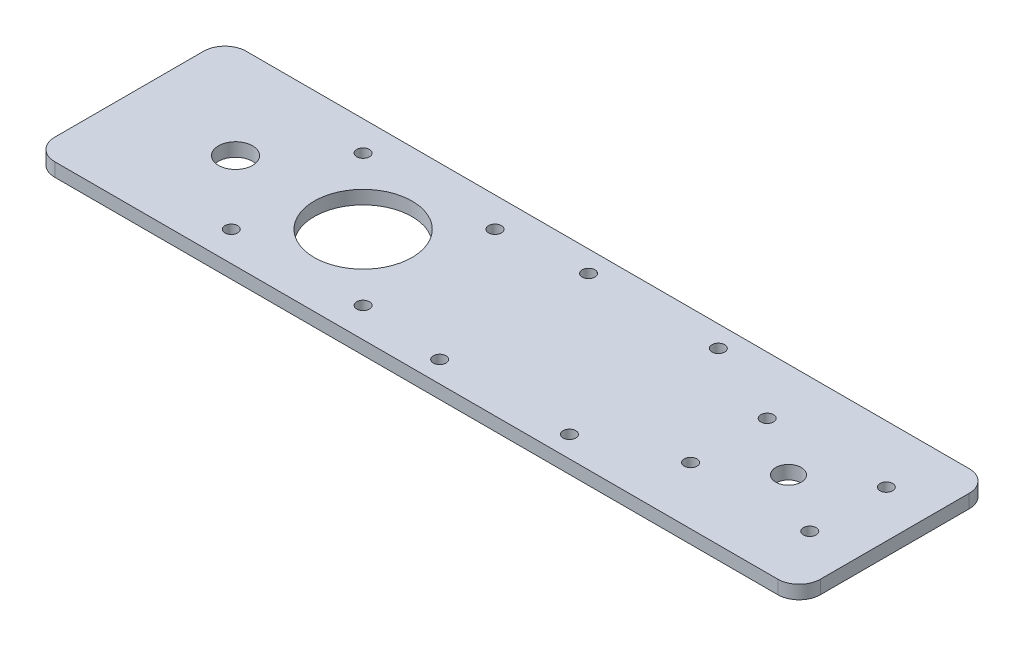
ISO-10303-21;
HEADER;
FILE_DESCRIPTION(('STEP AP214'),'2;1');
FILE_NAME('part.step','',(''),(''),'','','');
FILE_SCHEMA(('AUTOMOTIVE_DESIGN { 1 0 10303 214 1 1 1 1 }'));
ENDSEC;
DATA;
#1=APPLICATION_CONTEXT('core data for automotive mechanical design processes');
#2=APPLICATION_PROTOCOL_DEFINITION('international standard','automotive_design',2000,#1);
#3=PRODUCT_CONTEXT('',#1,'mechanical');
#4=PRODUCT('Part','Part','',(#3));
#5=PRODUCT_RELATED_PRODUCT_CATEGORY('part','',(#4));
#6=PRODUCT_DEFINITION_FORMATION('','',#4);
#7=PRODUCT_DEFINITION_CONTEXT('part definition',#1,'design');
#8=PRODUCT_DEFINITION('design','',#6,#7);
#9=PRODUCT_DEFINITION_SHAPE('','',#8);
#10=(LENGTH_UNIT() NAMED_UNIT(*) SI_UNIT(.MILLI.,.METRE.));
#11=(NAMED_UNIT(*) PLANE_ANGLE_UNIT() SI_UNIT($,.RADIAN.));
#12=(NAMED_UNIT(*) SI_UNIT($,.STERADIAN.) SOLID_ANGLE_UNIT());
#13=UNCERTAINTY_MEASURE_WITH_UNIT(LENGTH_MEASURE(1.E-05),#10,'distance_accuracy_value','');
#14=(GEOMETRIC_REPRESENTATION_CONTEXT(3) GLOBAL_UNCERTAINTY_ASSIGNED_CONTEXT((#13)) GLOBAL_UNIT_ASSIGNED_CONTEXT((#10,
#11,#12)) REPRESENTATION_CONTEXT('',''));
#15=CARTESIAN_POINT('',(0.,0.,0.));
#16=DIRECTION('',(0.,0.,1.));
#17=DIRECTION('',(1.,0.,0.));
#18=AXIS2_PLACEMENT_3D('',#15,#16,#17);
#19=CARTESIAN_POINT('',(-25.,3.175,-22.5));
#20=DIRECTION('',(1.,0.,0.));
#21=DIRECTION('',(0.,0.,-1.));
#22=AXIS2_PLACEMENT_3D('',#19,#20,#21);
#23=PLANE('',#22);
#24=DIRECTION('',(0.,0.,1.));
#25=VECTOR('',#24,1.);
#26=CARTESIAN_POINT('',(-25.,0.,-22.5));
#27=LINE('',#26,#25);
#28=CARTESIAN_POINT('',(-25.,0.,-17.5));
#29=VERTEX_POINT('',#28);
#30=CARTESIAN_POINT('',(-25.,0.,17.5));
#31=VERTEX_POINT('',#30);
#32=EDGE_CURVE('E136',#29,#31,#27,.T.);
#33=ORIENTED_EDGE('',*,*,#32,.T.);
#34=DIRECTION('',(0.,-1.,0.));
#35=VECTOR('',#34,1.);
#36=CARTESIAN_POINT('',(-25.,3.175,17.5));
#37=LINE('',#36,#35);
#38=CARTESIAN_POINT('',(-25.,3.175,17.5));
#39=VERTEX_POINT('',#38);
#40=EDGE_CURVE('E111',#31,#39,#37,.F.);
#41=ORIENTED_EDGE('',*,*,#40,.T.);
#42=DIRECTION('',(0.,0.,1.));
#43=VECTOR('',#42,1.);
#44=CARTESIAN_POINT('',(-25.,3.175,-22.5));
#45=LINE('',#44,#43);
#46=CARTESIAN_POINT('',(-25.,3.175,-17.5));
#47=VERTEX_POINT('',#46);
#48=EDGE_CURVE('E149',#47,#39,#45,.T.);
#49=ORIENTED_EDGE('',*,*,#48,.F.);
#50=DIRECTION('',(0.,-1.,0.));
#51=VECTOR('',#50,1.);
#52=CARTESIAN_POINT('',(-25.,3.175,-17.5));
#53=LINE('',#52,#51);
#54=EDGE_CURVE('E117',#47,#29,#53,.T.);
#55=ORIENTED_EDGE('',*,*,#54,.T.);
#56=EDGE_LOOP('',(#33,#41,#49,#55));
#57=FACE_BOUND('',#56,.T.);
#58=ADVANCED_FACE('F39',(#57),#23,.F.);
#59=CARTESIAN_POINT('',(-25.,3.175,22.5));
#60=DIRECTION('',(0.,0.,-1.));
#61=DIRECTION('',(-1.,0.,0.));
#62=AXIS2_PLACEMENT_3D('',#59,#60,#61);
#63=PLANE('',#62);
#64=DIRECTION('',(1.,0.,0.));
#65=VECTOR('',#64,1.);
#66=CARTESIAN_POINT('',(-25.,3.175,22.5));
#67=LINE('',#66,#65);
#68=CARTESIAN_POINT('',(-20.,3.175,22.5));
#69=VERTEX_POINT('',#68);
#70=CARTESIAN_POINT('',(150.,3.175,22.5));
#71=VERTEX_POINT('',#70);
#72=EDGE_CURVE('E127',#69,#71,#67,.T.);
#73=ORIENTED_EDGE('',*,*,#72,.F.);
#74=DIRECTION('',(0.,-1.,0.));
#75=VECTOR('',#74,1.);
#76=CARTESIAN_POINT('',(-20.,3.175,22.5));
#77=LINE('',#76,#75);
#78=CARTESIAN_POINT('',(-20.,0.,22.5));
#79=VERTEX_POINT('',#78);
#80=EDGE_CURVE('E110',#69,#79,#77,.T.);
#81=ORIENTED_EDGE('',*,*,#80,.T.);
#82=DIRECTION('',(1.,0.,0.));
#83=VECTOR('',#82,1.);
#84=CARTESIAN_POINT('',(-25.,0.,22.5));
#85=LINE('',#84,#83);
#86=CARTESIAN_POINT('',(150.,0.,22.5));
#87=VERTEX_POINT('',#86);
#88=EDGE_CURVE('E124',#79,#87,#85,.T.);
#89=ORIENTED_EDGE('',*,*,#88,.T.);
#90=DIRECTION('',(0.,-1.,0.));
#91=VECTOR('',#90,1.);
#92=CARTESIAN_POINT('',(150.,3.175,22.5));
#93=LINE('',#92,#91);
#94=EDGE_CURVE('E130',#87,#71,#93,.F.);
#95=ORIENTED_EDGE('',*,*,#94,.T.);
#96=EDGE_LOOP('',(#73,#81,#89,#95));
#97=FACE_BOUND('',#96,.T.);
#98=ADVANCED_FACE('F123',(#97),#63,.F.);
#99=CARTESIAN_POINT('',(155.,3.175,-22.5));
#100=DIRECTION('',(-1.,0.,0.));
#101=DIRECTION('',(0.,0.,1.));
#102=AXIS2_PLACEMENT_3D('',#99,#100,#101);
#103=PLANE('',#102);
#104=DIRECTION('',(0.,0.,-1.));
#105=VECTOR('',#104,1.);
#106=CARTESIAN_POINT('',(155.,0.,-22.5));
#107=LINE('',#106,#105);
#108=CARTESIAN_POINT('',(155.,0.,17.5));
#109=VERTEX_POINT('',#108);
#110=CARTESIAN_POINT('',(155.,0.,-17.5));
#111=VERTEX_POINT('',#110);
#112=EDGE_CURVE('E135',#109,#111,#107,.T.);
#113=ORIENTED_EDGE('',*,*,#112,.T.);
#114=DIRECTION('',(0.,-1.,0.));
#115=VECTOR('',#114,1.);
#116=CARTESIAN_POINT('',(155.,3.175,-17.5));
#117=LINE('',#116,#115);
#118=CARTESIAN_POINT('',(155.,3.175,-17.5));
#119=VERTEX_POINT('',#118);
#120=EDGE_CURVE('E11',#111,#119,#117,.F.);
#121=ORIENTED_EDGE('',*,*,#120,.T.);
#122=DIRECTION('',(0.,0.,-1.));
#123=VECTOR('',#122,1.);
#124=CARTESIAN_POINT('',(155.,3.175,-22.5));
#125=LINE('',#124,#123);
#126=CARTESIAN_POINT('',(155.,3.175,17.5));
#127=VERTEX_POINT('',#126);
#128=EDGE_CURVE('E188',#127,#119,#125,.T.);
#129=ORIENTED_EDGE('',*,*,#128,.F.);
#130=DIRECTION('',(0.,-1.,0.));
#131=VECTOR('',#130,1.);
#132=CARTESIAN_POINT('',(155.,3.175,17.5));
#133=LINE('',#132,#131);
#134=EDGE_CURVE('E48',#127,#109,#133,.T.);
#135=ORIENTED_EDGE('',*,*,#134,.T.);
#136=EDGE_LOOP('',(#113,#121,#129,#135));
#137=FACE_BOUND('',#136,.T.);
#138=ADVANCED_FACE('F186',(#137),#103,.F.);
#139=CARTESIAN_POINT('',(-25.,3.175,-22.5));
#140=DIRECTION('',(0.,0.,1.));
#141=DIRECTION('',(1.,0.,0.));
#142=AXIS2_PLACEMENT_3D('',#139,#140,#141);
#143=PLANE('',#142);
#144=DIRECTION('',(-1.,0.,0.));
#145=VECTOR('',#144,1.);
#146=CARTESIAN_POINT('',(-25.,0.,-22.5));
#147=LINE('',#146,#145);
#148=CARTESIAN_POINT('',(150.,0.,-22.5));
#149=VERTEX_POINT('',#148);
#150=CARTESIAN_POINT('',(-20.,0.,-22.5));
#151=VERTEX_POINT('',#150);
#152=EDGE_CURVE('E141',#149,#151,#147,.T.);
#153=ORIENTED_EDGE('',*,*,#152,.T.);
#154=DIRECTION('',(0.,-1.,0.));
#155=VECTOR('',#154,1.);
#156=CARTESIAN_POINT('',(-20.,3.175,-22.5));
#157=LINE('',#156,#155);
#158=CARTESIAN_POINT('',(-20.,3.175,-22.5));
#159=VERTEX_POINT('',#158);
#160=EDGE_CURVE('E55',#151,#159,#157,.F.);
#161=ORIENTED_EDGE('',*,*,#160,.T.);
#162=DIRECTION('',(-1.,0.,0.));
#163=VECTOR('',#162,1.);
#164=CARTESIAN_POINT('',(-25.,3.175,-22.5));
#165=LINE('',#164,#163);
#166=CARTESIAN_POINT('',(150.,3.175,-22.5));
#167=VERTEX_POINT('',#166);
#168=EDGE_CURVE('E151',#167,#159,#165,.T.);
#169=ORIENTED_EDGE('',*,*,#168,.F.);
#170=DIRECTION('',(0.,-1.,0.));
#171=VECTOR('',#170,1.);
#172=CARTESIAN_POINT('',(150.,3.175,-22.5));
#173=LINE('',#172,#171);
#174=EDGE_CURVE('E176',#167,#149,#173,.T.);
#175=ORIENTED_EDGE('',*,*,#174,.T.);
#176=EDGE_LOOP('',(#153,#161,#169,#175));
#177=FACE_BOUND('',#176,.T.);
#178=ADVANCED_FACE('F195',(#177),#143,.F.);
#179=CARTESIAN_POINT('',(0.,3.175,0.));
#180=DIRECTION('',(0.,1.,0.));
#181=DIRECTION('',(0.,0.,1.));
#182=AXIS2_PLACEMENT_3D('',#179,#180,#181);
#183=PLANE('',#182);
#184=CARTESIAN_POINT('',(65.4999999999999,3.175,-17.5));
#185=DIRECTION('',(0.,1.,0.));
#186=DIRECTION('',(0.,0.,-1.));
#187=AXIS2_PLACEMENT_3D('',#184,#185,#186);
#188=CIRCLE('',#187,1.5);
#189=CARTESIAN_POINT('',(65.4999999999999,3.175,-19.));
#190=VERTEX_POINT('',#189);
#191=EDGE_CURVE('E302',#190,#190,#188,.T.);
#192=ORIENTED_EDGE('',*,*,#191,.F.);
#193=EDGE_LOOP('',(#192));
#194=FACE_BOUND('',#193,.T.);
#195=CARTESIAN_POINT('',(95.9999999999999,3.175,-17.5));
#196=DIRECTION('',(0.,1.,0.));
#197=DIRECTION('',(0.,0.,-1.));
#198=AXIS2_PLACEMENT_3D('',#195,#196,#197);
#199=CIRCLE('',#198,1.5);
#200=CARTESIAN_POINT('',(95.9999999999999,3.175,-19.));
#201=VERTEX_POINT('',#200);
#202=EDGE_CURVE('E310',#201,#201,#199,.T.);
#203=ORIENTED_EDGE('',*,*,#202,.F.);
#204=EDGE_LOOP('',(#203));
#205=FACE_BOUND('',#204,.T.);
#206=CARTESIAN_POINT('',(96.,3.175,17.5));
#207=DIRECTION('',(0.,1.,0.));
#208=DIRECTION('',(0.,0.,1.));
#209=AXIS2_PLACEMENT_3D('',#206,#207,#208);
#210=CIRCLE('',#209,1.5);
#211=CARTESIAN_POINT('',(96.,3.175,19.));
#212=VERTEX_POINT('',#211);
#213=EDGE_CURVE('E318',#212,#212,#210,.T.);
#214=ORIENTED_EDGE('',*,*,#213,.F.);
#215=EDGE_LOOP('',(#214));
#216=FACE_BOUND('',#215,.T.);
#217=CARTESIAN_POINT('',(65.5,3.175,17.5));
#218=DIRECTION('',(0.,1.,0.));
#219=DIRECTION('',(0.,0.,1.));
#220=AXIS2_PLACEMENT_3D('',#217,#218,#219);
#221=CIRCLE('',#220,1.5);
#222=CARTESIAN_POINT('',(65.5,3.175,19.));
#223=VERTEX_POINT('',#222);
#224=EDGE_CURVE('E294',#223,#223,#221,.T.);
#225=ORIENTED_EDGE('',*,*,#224,.F.);
#226=EDGE_LOOP('',(#225));
#227=FACE_BOUND('',#226,.T.);
#228=CARTESIAN_POINT('',(30.,3.175,0.));
#229=DIRECTION('',(0.,1.,0.));
#230=DIRECTION('',(0.,0.,1.));
#231=AXIS2_PLACEMENT_3D('',#228,#229,#230);
#232=CIRCLE('',#231,11.5);
#233=CARTESIAN_POINT('',(30.,3.175,11.5));
#234=VERTEX_POINT('',#233);
#235=EDGE_CURVE('E262',#234,#234,#232,.T.);
#236=ORIENTED_EDGE('',*,*,#235,.F.);
#237=EDGE_LOOP('',(#236));
#238=FACE_BOUND('',#237,.T.);
#239=CARTESIAN_POINT('',(45.5,3.175,15.5));
#240=DIRECTION('',(0.,1.,0.));
#241=DIRECTION('',(0.,0.,-1.));
#242=AXIS2_PLACEMENT_3D('',#239,#240,#241);
#243=CIRCLE('',#242,1.5);
#244=CARTESIAN_POINT('',(45.5,3.175,14.));
#245=VERTEX_POINT('',#244);
#246=EDGE_CURVE('E271',#245,#245,#243,.T.);
#247=ORIENTED_EDGE('',*,*,#246,.F.);
#248=EDGE_LOOP('',(#247));
#249=FACE_BOUND('',#248,.T.);
#250=CARTESIAN_POINT('',(45.5,3.175,-15.5));
#251=DIRECTION('',(0.,1.,0.));
#252=DIRECTION('',(0.,0.,1.));
#253=AXIS2_PLACEMENT_3D('',#250,#251,#252);
#254=CIRCLE('',#253,1.5);
#255=CARTESIAN_POINT('',(45.5,3.175,-14.));
#256=VERTEX_POINT('',#255);
#257=EDGE_CURVE('E279',#256,#256,#254,.T.);
#258=ORIENTED_EDGE('',*,*,#257,.F.);
#259=EDGE_LOOP('',(#258));
#260=FACE_BOUND('',#259,.T.);
#261=CARTESIAN_POINT('',(14.5,3.175,-15.5));
#262=DIRECTION('',(0.,1.,0.));
#263=DIRECTION('',(0.,0.,-1.));
#264=AXIS2_PLACEMENT_3D('',#261,#262,#263);
#265=CIRCLE('',#264,1.5);
#266=CARTESIAN_POINT('',(14.5,3.175,-17.));
#267=VERTEX_POINT('',#266);
#268=EDGE_CURVE('E287',#267,#267,#265,.T.);
#269=ORIENTED_EDGE('',*,*,#268,.F.);
#270=EDGE_LOOP('',(#269));
#271=FACE_BOUND('',#270,.T.);
#272=CARTESIAN_POINT('',(14.5,3.175,15.5));
#273=DIRECTION('',(0.,1.,0.));
#274=DIRECTION('',(0.,0.,1.));
#275=AXIS2_PLACEMENT_3D('',#272,#273,#274);
#276=CIRCLE('',#275,1.5);
#277=CARTESIAN_POINT('',(14.5,3.175,17.));
#278=VERTEX_POINT('',#277);
#279=EDGE_CURVE('E254',#278,#278,#276,.T.);
#280=ORIENTED_EDGE('',*,*,#279,.F.);
#281=EDGE_LOOP('',(#280));
#282=FACE_BOUND('',#281,.T.);
#283=CARTESIAN_POINT('',(0.,3.175,0.));
#284=DIRECTION('',(0.,1.,0.));
#285=DIRECTION('',(0.,0.,1.));
#286=AXIS2_PLACEMENT_3D('',#283,#284,#285);
#287=CIRCLE('',#286,4.);
#288=CARTESIAN_POINT('',(0.,3.175,4.));
#289=VERTEX_POINT('',#288);
#290=EDGE_CURVE('E246',#289,#289,#287,.T.);
#291=ORIENTED_EDGE('',*,*,#290,.F.);
#292=EDGE_LOOP('',(#291));
#293=FACE_BOUND('',#292,.T.);
#294=CARTESIAN_POINT('',(116.,3.175,9.00000000000001));
#295=DIRECTION('',(0.,1.,0.));
#296=DIRECTION('',(0.,0.,-1.));
#297=AXIS2_PLACEMENT_3D('',#294,#295,#296);
#298=CIRCLE('',#297,1.5);
#299=CARTESIAN_POINT('',(116.,3.175,7.50000000000001));
#300=VERTEX_POINT('',#299);
#301=EDGE_CURVE('E214',#300,#300,#298,.T.);
#302=ORIENTED_EDGE('',*,*,#301,.F.);
#303=EDGE_LOOP('',(#302));
#304=FACE_BOUND('',#303,.T.);
#305=CARTESIAN_POINT('',(144.,3.175,9.));
#306=DIRECTION('',(0.,1.,0.));
#307=DIRECTION('',(0.,0.,1.));
#308=AXIS2_PLACEMENT_3D('',#305,#306,#307);
#309=CIRCLE('',#308,1.50000000000003);
#310=CARTESIAN_POINT('',(144.,3.175,10.5));
#311=VERTEX_POINT('',#310);
#312=EDGE_CURVE('E223',#311,#311,#309,.T.);
#313=ORIENTED_EDGE('',*,*,#312,.F.);
#314=EDGE_LOOP('',(#313));
#315=FACE_BOUND('',#314,.T.);
#316=CARTESIAN_POINT('',(144.,3.175,-9.));
#317=DIRECTION('',(0.,1.,0.));
#318=DIRECTION('',(0.,0.,-1.));
#319=AXIS2_PLACEMENT_3D('',#316,#317,#318);
#320=CIRCLE('',#319,1.50000000000003);
#321=CARTESIAN_POINT('',(144.,3.175,-10.5));
#322=VERTEX_POINT('',#321);
#323=EDGE_CURVE('E231',#322,#322,#320,.T.);
#324=ORIENTED_EDGE('',*,*,#323,.F.);
#325=EDGE_LOOP('',(#324));
#326=FACE_BOUND('',#325,.T.);
#327=CARTESIAN_POINT('',(116.,3.175,-8.99999999999999));
#328=DIRECTION('',(0.,1.,0.));
#329=DIRECTION('',(0.,0.,1.));
#330=AXIS2_PLACEMENT_3D('',#327,#328,#329);
#331=CIRCLE('',#330,1.5);
#332=CARTESIAN_POINT('',(116.,3.175,-7.5));
#333=VERTEX_POINT('',#332);
#334=EDGE_CURVE('E239',#333,#333,#331,.T.);
#335=ORIENTED_EDGE('',*,*,#334,.F.);
#336=EDGE_LOOP('',(#335));
#337=FACE_BOUND('',#336,.T.);
#338=CARTESIAN_POINT('',(130.,3.175,0.));
#339=DIRECTION('',(0.,1.,0.));
#340=DIRECTION('',(0.,0.,1.));
#341=AXIS2_PLACEMENT_3D('',#338,#339,#340);
#342=CIRCLE('',#341,2.99999999999999);
#343=CARTESIAN_POINT('',(130.,3.175,2.99999999999999));
#344=VERTEX_POINT('',#343);
#345=EDGE_CURVE('E206',#344,#344,#342,.T.);
#346=ORIENTED_EDGE('',*,*,#345,.F.);
#347=EDGE_LOOP('',(#346));
#348=FACE_BOUND('',#347,.T.);
#349=ORIENTED_EDGE('',*,*,#48,.T.);
#350=CARTESIAN_POINT('',(-20.,3.175,17.5));
#351=DIRECTION('',(0.,1.,0.));
#352=DIRECTION('',(0.,0.,1.));
#353=AXIS2_PLACEMENT_3D('',#350,#351,#352);
#354=CIRCLE('',#353,5.);
#355=EDGE_CURVE('E173',#39,#69,#354,.T.);
#356=ORIENTED_EDGE('',*,*,#355,.T.);
#357=ORIENTED_EDGE('',*,*,#72,.T.);
#358=CARTESIAN_POINT('',(150.,3.175,17.5));
#359=DIRECTION('',(0.,1.,0.));
#360=DIRECTION('',(0.,0.,1.));
#361=AXIS2_PLACEMENT_3D('',#358,#359,#360);
#362=CIRCLE('',#361,5.);
#363=EDGE_CURVE('E165',#71,#127,#362,.T.);
#364=ORIENTED_EDGE('',*,*,#363,.T.);
#365=ORIENTED_EDGE('',*,*,#128,.T.);
#366=CARTESIAN_POINT('',(150.,3.175,-17.5));
#367=DIRECTION('',(0.,1.,0.));
#368=DIRECTION('',(0.,0.,1.));
#369=AXIS2_PLACEMENT_3D('',#366,#367,#368);
#370=CIRCLE('',#369,5.);
#371=EDGE_CURVE('E62',#119,#167,#370,.T.);
#372=ORIENTED_EDGE('',*,*,#371,.T.);
#373=ORIENTED_EDGE('',*,*,#168,.T.);
#374=CARTESIAN_POINT('',(-20.,3.175,-17.5));
#375=DIRECTION('',(0.,1.,0.));
#376=DIRECTION('',(0.,0.,1.));
#377=AXIS2_PLACEMENT_3D('',#374,#375,#376);
#378=CIRCLE('',#377,5.);
#379=EDGE_CURVE('E170',#159,#47,#378,.T.);
#380=ORIENTED_EDGE('',*,*,#379,.T.);
#381=EDGE_LOOP('',(#349,#356,#357,#364,#365,#372,#373,#380));
#382=FACE_BOUND('',#381,.T.);
#383=ADVANCED_FACE('F336',(#194,#205,#216,#227,#238,#249,#260,#271,#282,#293,#304,#315,#326,
#337,#348,#382),#183,.T.);
#384=CARTESIAN_POINT('',(0.,0.,0.));
#385=DIRECTION('',(0.,1.,0.));
#386=DIRECTION('',(0.,0.,1.));
#387=AXIS2_PLACEMENT_3D('',#384,#385,#386);
#388=PLANE('',#387);
#389=CARTESIAN_POINT('',(65.4999999999999,0.,-17.5));
#390=DIRECTION('',(0.,1.,0.));
#391=DIRECTION('',(0.,0.,-1.));
#392=AXIS2_PLACEMENT_3D('',#389,#390,#391);
#393=CIRCLE('',#392,1.5);
#394=CARTESIAN_POINT('',(65.4999999999999,0.,-19.));
#395=VERTEX_POINT('',#394);
#396=EDGE_CURVE('E306',#395,#395,#393,.T.);
#397=ORIENTED_EDGE('',*,*,#396,.T.);
#398=EDGE_LOOP('',(#397));
#399=FACE_BOUND('',#398,.T.);
#400=CARTESIAN_POINT('',(95.9999999999999,0.,-17.5));
#401=DIRECTION('',(0.,1.,0.));
#402=DIRECTION('',(0.,0.,-1.));
#403=AXIS2_PLACEMENT_3D('',#400,#401,#402);
#404=CIRCLE('',#403,1.5);
#405=CARTESIAN_POINT('',(95.9999999999999,0.,-19.));
#406=VERTEX_POINT('',#405);
#407=EDGE_CURVE('E314',#406,#406,#404,.T.);
#408=ORIENTED_EDGE('',*,*,#407,.T.);
#409=EDGE_LOOP('',(#408));
#410=FACE_BOUND('',#409,.T.);
#411=CARTESIAN_POINT('',(96.,0.,17.5));
#412=DIRECTION('',(0.,1.,0.));
#413=DIRECTION('',(0.,0.,1.));
#414=AXIS2_PLACEMENT_3D('',#411,#412,#413);
#415=CIRCLE('',#414,1.5);
#416=CARTESIAN_POINT('',(96.,0.,19.));
#417=VERTEX_POINT('',#416);
#418=EDGE_CURVE('E298',#417,#417,#415,.T.);
#419=ORIENTED_EDGE('',*,*,#418,.T.);
#420=EDGE_LOOP('',(#419));
#421=FACE_BOUND('',#420,.T.);
#422=CARTESIAN_POINT('',(65.5,0.,17.5));
#423=DIRECTION('',(0.,1.,0.));
#424=DIRECTION('',(0.,0.,1.));
#425=AXIS2_PLACEMENT_3D('',#422,#423,#424);
#426=CIRCLE('',#425,1.5);
#427=CARTESIAN_POINT('',(65.5,0.,19.));
#428=VERTEX_POINT('',#427);
#429=EDGE_CURVE('E267',#428,#428,#426,.T.);
#430=ORIENTED_EDGE('',*,*,#429,.T.);
#431=EDGE_LOOP('',(#430));
#432=FACE_BOUND('',#431,.T.);
#433=CARTESIAN_POINT('',(30.,0.,0.));
#434=DIRECTION('',(0.,1.,0.));
#435=DIRECTION('',(0.,0.,1.));
#436=AXIS2_PLACEMENT_3D('',#433,#434,#435);
#437=CIRCLE('',#436,11.5);
#438=CARTESIAN_POINT('',(30.,0.,11.5));
#439=VERTEX_POINT('',#438);
#440=EDGE_CURVE('E266',#439,#439,#437,.T.);
#441=ORIENTED_EDGE('',*,*,#440,.T.);
#442=EDGE_LOOP('',(#441));
#443=FACE_BOUND('',#442,.T.);
#444=CARTESIAN_POINT('',(45.5,0.,15.5));
#445=DIRECTION('',(0.,1.,0.));
#446=DIRECTION('',(0.,0.,-1.));
#447=AXIS2_PLACEMENT_3D('',#444,#445,#446);
#448=CIRCLE('',#447,1.5);
#449=CARTESIAN_POINT('',(45.5,0.,14.));
#450=VERTEX_POINT('',#449);
#451=EDGE_CURVE('E275',#450,#450,#448,.T.);
#452=ORIENTED_EDGE('',*,*,#451,.T.);
#453=EDGE_LOOP('',(#452));
#454=FACE_BOUND('',#453,.T.);
#455=CARTESIAN_POINT('',(45.5,0.,-15.5));
#456=DIRECTION('',(0.,1.,0.));
#457=DIRECTION('',(0.,0.,1.));
#458=AXIS2_PLACEMENT_3D('',#455,#456,#457);
#459=CIRCLE('',#458,1.5);
#460=CARTESIAN_POINT('',(45.5,0.,-14.));
#461=VERTEX_POINT('',#460);
#462=EDGE_CURVE('E283',#461,#461,#459,.T.);
#463=ORIENTED_EDGE('',*,*,#462,.T.);
#464=EDGE_LOOP('',(#463));
#465=FACE_BOUND('',#464,.T.);
#466=CARTESIAN_POINT('',(14.5,0.,-15.5));
#467=DIRECTION('',(0.,1.,0.));
#468=DIRECTION('',(0.,0.,-1.));
#469=AXIS2_PLACEMENT_3D('',#466,#467,#468);
#470=CIRCLE('',#469,1.5);
#471=CARTESIAN_POINT('',(14.5,0.,-17.));
#472=VERTEX_POINT('',#471);
#473=EDGE_CURVE('E258',#472,#472,#470,.T.);
#474=ORIENTED_EDGE('',*,*,#473,.T.);
#475=EDGE_LOOP('',(#474));
#476=FACE_BOUND('',#475,.T.);
#477=CARTESIAN_POINT('',(14.5,0.,15.5));
#478=DIRECTION('',(0.,1.,0.));
#479=DIRECTION('',(0.,0.,1.));
#480=AXIS2_PLACEMENT_3D('',#477,#478,#479);
#481=CIRCLE('',#480,1.5);
#482=CARTESIAN_POINT('',(14.5,0.,17.));
#483=VERTEX_POINT('',#482);
#484=EDGE_CURVE('E250',#483,#483,#481,.T.);
#485=ORIENTED_EDGE('',*,*,#484,.T.);
#486=EDGE_LOOP('',(#485));
#487=FACE_BOUND('',#486,.T.);
#488=CARTESIAN_POINT('',(0.,0.,0.));
#489=DIRECTION('',(0.,1.,0.));
#490=DIRECTION('',(0.,0.,1.));
#491=AXIS2_PLACEMENT_3D('',#488,#489,#490);
#492=CIRCLE('',#491,4.);
#493=CARTESIAN_POINT('',(0.,0.,4.));
#494=VERTEX_POINT('',#493);
#495=EDGE_CURVE('E219',#494,#494,#492,.T.);
#496=ORIENTED_EDGE('',*,*,#495,.T.);
#497=EDGE_LOOP('',(#496));
#498=FACE_BOUND('',#497,.T.);
#499=CARTESIAN_POINT('',(116.,0.,9.00000000000001));
#500=DIRECTION('',(0.,1.,0.));
#501=DIRECTION('',(0.,0.,-1.));
#502=AXIS2_PLACEMENT_3D('',#499,#500,#501);
#503=CIRCLE('',#502,1.5);
#504=CARTESIAN_POINT('',(116.,0.,7.50000000000001));
#505=VERTEX_POINT('',#504);
#506=EDGE_CURVE('E218',#505,#505,#503,.T.);
#507=ORIENTED_EDGE('',*,*,#506,.T.);
#508=EDGE_LOOP('',(#507));
#509=FACE_BOUND('',#508,.T.);
#510=CARTESIAN_POINT('',(144.,0.,9.));
#511=DIRECTION('',(0.,1.,0.));
#512=DIRECTION('',(0.,0.,1.));
#513=AXIS2_PLACEMENT_3D('',#510,#511,#512);
#514=CIRCLE('',#513,1.50000000000003);
#515=CARTESIAN_POINT('',(144.,0.,10.5));
#516=VERTEX_POINT('',#515);
#517=EDGE_CURVE('E227',#516,#516,#514,.T.);
#518=ORIENTED_EDGE('',*,*,#517,.T.);
#519=EDGE_LOOP('',(#518));
#520=FACE_BOUND('',#519,.T.);
#521=CARTESIAN_POINT('',(144.,0.,-9.));
#522=DIRECTION('',(0.,1.,0.));
#523=DIRECTION('',(0.,0.,-1.));
#524=AXIS2_PLACEMENT_3D('',#521,#522,#523);
#525=CIRCLE('',#524,1.50000000000003);
#526=CARTESIAN_POINT('',(144.,0.,-10.5));
#527=VERTEX_POINT('',#526);
#528=EDGE_CURVE('E235',#527,#527,#525,.T.);
#529=ORIENTED_EDGE('',*,*,#528,.T.);
#530=EDGE_LOOP('',(#529));
#531=FACE_BOUND('',#530,.T.);
#532=CARTESIAN_POINT('',(116.,0.,-8.99999999999999));
#533=DIRECTION('',(0.,1.,0.));
#534=DIRECTION('',(0.,0.,1.));
#535=AXIS2_PLACEMENT_3D('',#532,#533,#534);
#536=CIRCLE('',#535,1.5);
#537=CARTESIAN_POINT('',(116.,0.,-7.5));
#538=VERTEX_POINT('',#537);
#539=EDGE_CURVE('E210',#538,#538,#536,.T.);
#540=ORIENTED_EDGE('',*,*,#539,.T.);
#541=EDGE_LOOP('',(#540));
#542=FACE_BOUND('',#541,.T.);
#543=CARTESIAN_POINT('',(130.,0.,0.));
#544=DIRECTION('',(0.,1.,0.));
#545=DIRECTION('',(0.,0.,1.));
#546=AXIS2_PLACEMENT_3D('',#543,#544,#545);
#547=CIRCLE('',#546,2.99999999999999);
#548=CARTESIAN_POINT('',(130.,0.,2.99999999999999));
#549=VERTEX_POINT('',#548);
#550=EDGE_CURVE('E143',#549,#549,#547,.T.);
#551=ORIENTED_EDGE('',*,*,#550,.T.);
#552=EDGE_LOOP('',(#551));
#553=FACE_BOUND('',#552,.T.);
#554=ORIENTED_EDGE('',*,*,#88,.F.);
#555=CARTESIAN_POINT('',(-20.,0.,17.5));
#556=DIRECTION('',(0.,1.,0.));
#557=DIRECTION('',(0.,0.,1.));
#558=AXIS2_PLACEMENT_3D('',#555,#556,#557);
#559=CIRCLE('',#558,5.);
#560=EDGE_CURVE('E106',#79,#31,#559,.F.);
#561=ORIENTED_EDGE('',*,*,#560,.T.);
#562=ORIENTED_EDGE('',*,*,#32,.F.);
#563=CARTESIAN_POINT('',(-20.,0.,-17.5));
#564=DIRECTION('',(0.,1.,0.));
#565=DIRECTION('',(0.,0.,1.));
#566=AXIS2_PLACEMENT_3D('',#563,#564,#565);
#567=CIRCLE('',#566,5.);
#568=EDGE_CURVE('E118',#29,#151,#567,.F.);
#569=ORIENTED_EDGE('',*,*,#568,.T.);
#570=ORIENTED_EDGE('',*,*,#152,.F.);
#571=CARTESIAN_POINT('',(150.,0.,-17.5));
#572=DIRECTION('',(0.,1.,0.));
#573=DIRECTION('',(0.,0.,1.));
#574=AXIS2_PLACEMENT_3D('',#571,#572,#573);
#575=CIRCLE('',#574,5.);
#576=EDGE_CURVE('E155',#149,#111,#575,.F.);
#577=ORIENTED_EDGE('',*,*,#576,.T.);
#578=ORIENTED_EDGE('',*,*,#112,.F.);
#579=CARTESIAN_POINT('',(150.,0.,17.5));
#580=DIRECTION('',(0.,1.,0.));
#581=DIRECTION('',(0.,0.,1.));
#582=AXIS2_PLACEMENT_3D('',#579,#580,#581);
#583=CIRCLE('',#582,5.);
#584=EDGE_CURVE('E129',#109,#87,#583,.F.);
#585=ORIENTED_EDGE('',*,*,#584,.T.);
#586=EDGE_LOOP('',(#554,#561,#562,#569,#570,#577,#578,#585));
#587=FACE_BOUND('',#586,.T.);
#588=ADVANCED_FACE('F132',(#399,#410,#421,#432,#443,#454,#465,#476,#487,#498,#509,#520,#531,
#542,#553,#587),#388,.F.);
#589=CARTESIAN_POINT('',(-20.,3.175,17.5));
#590=DIRECTION('',(0.,-1.,0.));
#591=DIRECTION('',(0.,0.,-1.));
#592=AXIS2_PLACEMENT_3D('',#589,#590,#591);
#593=CYLINDRICAL_SURFACE('',#592,5.);
#594=ORIENTED_EDGE('',*,*,#355,.F.);
#595=ORIENTED_EDGE('',*,*,#40,.F.);
#596=ORIENTED_EDGE('',*,*,#560,.F.);
#597=ORIENTED_EDGE('',*,*,#80,.F.);
#598=EDGE_LOOP('',(#594,#595,#596,#597));
#599=FACE_BOUND('',#598,.T.);
#600=ADVANCED_FACE('F109',(#599),#593,.T.);
#601=CARTESIAN_POINT('',(-20.,3.175,-17.5));
#602=DIRECTION('',(0.,-1.,0.));
#603=DIRECTION('',(0.,0.,-1.));
#604=AXIS2_PLACEMENT_3D('',#601,#602,#603);
#605=CYLINDRICAL_SURFACE('',#604,5.);
#606=ORIENTED_EDGE('',*,*,#379,.F.);
#607=ORIENTED_EDGE('',*,*,#160,.F.);
#608=ORIENTED_EDGE('',*,*,#568,.F.);
#609=ORIENTED_EDGE('',*,*,#54,.F.);
#610=EDGE_LOOP('',(#606,#607,#608,#609));
#611=FACE_BOUND('',#610,.T.);
#612=ADVANCED_FACE('F368',(#611),#605,.T.);
#613=CARTESIAN_POINT('',(150.,3.175,-17.5));
#614=DIRECTION('',(0.,-1.,0.));
#615=DIRECTION('',(0.,0.,-1.));
#616=AXIS2_PLACEMENT_3D('',#613,#614,#615);
#617=CYLINDRICAL_SURFACE('',#616,5.);
#618=ORIENTED_EDGE('',*,*,#371,.F.);
#619=ORIENTED_EDGE('',*,*,#120,.F.);
#620=ORIENTED_EDGE('',*,*,#576,.F.);
#621=ORIENTED_EDGE('',*,*,#174,.F.);
#622=EDGE_LOOP('',(#618,#619,#620,#621));
#623=FACE_BOUND('',#622,.T.);
#624=ADVANCED_FACE('F194',(#623),#617,.T.);
#625=CARTESIAN_POINT('',(150.,3.175,17.5));
#626=DIRECTION('',(0.,-1.,0.));
#627=DIRECTION('',(0.,0.,-1.));
#628=AXIS2_PLACEMENT_3D('',#625,#626,#627);
#629=CYLINDRICAL_SURFACE('',#628,5.);
#630=ORIENTED_EDGE('',*,*,#363,.F.);
#631=ORIENTED_EDGE('',*,*,#94,.F.);
#632=ORIENTED_EDGE('',*,*,#584,.F.);
#633=ORIENTED_EDGE('',*,*,#134,.F.);
#634=EDGE_LOOP('',(#630,#631,#632,#633));
#635=FACE_BOUND('',#634,.T.);
#636=ADVANCED_FACE('F41',(#635),#629,.T.);
#637=CARTESIAN_POINT('',(130.,0.,0.));
#638=DIRECTION('',(0.,1.,0.));
#639=DIRECTION('',(0.,0.,1.));
#640=AXIS2_PLACEMENT_3D('',#637,#638,#639);
#641=CYLINDRICAL_SURFACE('',#640,2.99999999999999);
#642=ORIENTED_EDGE('',*,*,#550,.F.);
#643=EDGE_LOOP('',(#642));
#644=FACE_BOUND('',#643,.T.);
#645=ORIENTED_EDGE('',*,*,#345,.T.);
#646=EDGE_LOOP('',(#645));
#647=FACE_BOUND('',#646,.T.);
#648=ADVANCED_FACE('F390',(#644,#647),#641,.F.);
#649=CARTESIAN_POINT('',(116.,0.,-8.99999999999999));
#650=DIRECTION('',(0.,1.,0.));
#651=DIRECTION('',(0.,0.,1.));
#652=AXIS2_PLACEMENT_3D('',#649,#650,#651);
#653=CYLINDRICAL_SURFACE('',#652,1.5);
#654=ORIENTED_EDGE('',*,*,#539,.F.);
#655=EDGE_LOOP('',(#654));
#656=FACE_BOUND('',#655,.T.);
#657=ORIENTED_EDGE('',*,*,#334,.T.);
#658=EDGE_LOOP('',(#657));
#659=FACE_BOUND('',#658,.T.);
#660=ADVANCED_FACE('F393',(#656,#659),#653,.F.);
#661=CARTESIAN_POINT('',(144.,0.,-9.));
#662=DIRECTION('',(0.,1.,0.));
#663=DIRECTION('',(0.,0.,1.));
#664=AXIS2_PLACEMENT_3D('',#661,#662,#663);
#665=CYLINDRICAL_SURFACE('',#664,1.50000000000003);
#666=ORIENTED_EDGE('',*,*,#528,.F.);
#667=EDGE_LOOP('',(#666));
#668=FACE_BOUND('',#667,.T.);
#669=ORIENTED_EDGE('',*,*,#323,.T.);
#670=EDGE_LOOP('',(#669));
#671=FACE_BOUND('',#670,.T.);
#672=ADVANCED_FACE('F403',(#668,#671),#665,.F.);
#673=CARTESIAN_POINT('',(144.,0.,9.));
#674=DIRECTION('',(0.,1.,0.));
#675=DIRECTION('',(0.,0.,1.));
#676=AXIS2_PLACEMENT_3D('',#673,#674,#675);
#677=CYLINDRICAL_SURFACE('',#676,1.50000000000003);
#678=ORIENTED_EDGE('',*,*,#517,.F.);
#679=EDGE_LOOP('',(#678));
#680=FACE_BOUND('',#679,.T.);
#681=ORIENTED_EDGE('',*,*,#312,.T.);
#682=EDGE_LOOP('',(#681));
#683=FACE_BOUND('',#682,.T.);
#684=ADVANCED_FACE('F399',(#680,#683),#677,.F.);
#685=CARTESIAN_POINT('',(116.,0.,9.00000000000001));
#686=DIRECTION('',(0.,1.,0.));
#687=DIRECTION('',(0.,0.,1.));
#688=AXIS2_PLACEMENT_3D('',#685,#686,#687);
#689=CYLINDRICAL_SURFACE('',#688,1.5);
#690=ORIENTED_EDGE('',*,*,#506,.F.);
#691=EDGE_LOOP('',(#690));
#692=FACE_BOUND('',#691,.T.);
#693=ORIENTED_EDGE('',*,*,#301,.T.);
#694=EDGE_LOOP('',(#693));
#695=FACE_BOUND('',#694,.T.);
#696=ADVANCED_FACE('F395',(#692,#695),#689,.F.);
#697=CARTESIAN_POINT('',(0.,0.,0.));
#698=DIRECTION('',(0.,1.,0.));
#699=DIRECTION('',(0.,0.,1.));
#700=AXIS2_PLACEMENT_3D('',#697,#698,#699);
#701=CYLINDRICAL_SURFACE('',#700,4.);
#702=ORIENTED_EDGE('',*,*,#495,.F.);
#703=EDGE_LOOP('',(#702));
#704=FACE_BOUND('',#703,.T.);
#705=ORIENTED_EDGE('',*,*,#290,.T.);
#706=EDGE_LOOP('',(#705));
#707=FACE_BOUND('',#706,.T.);
#708=ADVANCED_FACE('F398',(#704,#707),#701,.F.);
#709=CARTESIAN_POINT('',(14.5,0.,15.5));
#710=DIRECTION('',(0.,1.,0.));
#711=DIRECTION('',(0.,0.,1.));
#712=AXIS2_PLACEMENT_3D('',#709,#710,#711);
#713=CYLINDRICAL_SURFACE('',#712,1.5);
#714=ORIENTED_EDGE('',*,*,#484,.F.);
#715=EDGE_LOOP('',(#714));
#716=FACE_BOUND('',#715,.T.);
#717=ORIENTED_EDGE('',*,*,#279,.T.);
#718=EDGE_LOOP('',(#717));
#719=FACE_BOUND('',#718,.T.);
#720=ADVANCED_FACE('F413',(#716,#719),#713,.F.);
#721=CARTESIAN_POINT('',(14.5,0.,-15.5));
#722=DIRECTION('',(0.,1.,0.));
#723=DIRECTION('',(0.,0.,1.));
#724=AXIS2_PLACEMENT_3D('',#721,#722,#723);
#725=CYLINDRICAL_SURFACE('',#724,1.5);
#726=ORIENTED_EDGE('',*,*,#473,.F.);
#727=EDGE_LOOP('',(#726));
#728=FACE_BOUND('',#727,.T.);
#729=ORIENTED_EDGE('',*,*,#268,.T.);
#730=EDGE_LOOP('',(#729));
#731=FACE_BOUND('',#730,.T.);
#732=ADVANCED_FACE('F417',(#728,#731),#725,.F.);
#733=CARTESIAN_POINT('',(45.5,0.,-15.5));
#734=DIRECTION('',(0.,1.,0.));
#735=DIRECTION('',(0.,0.,1.));
#736=AXIS2_PLACEMENT_3D('',#733,#734,#735);
#737=CYLINDRICAL_SURFACE('',#736,1.5);
#738=ORIENTED_EDGE('',*,*,#462,.F.);
#739=EDGE_LOOP('',(#738));
#740=FACE_BOUND('',#739,.T.);
#741=ORIENTED_EDGE('',*,*,#257,.T.);
#742=EDGE_LOOP('',(#741));
#743=FACE_BOUND('',#742,.T.);
#744=ADVANCED_FACE('F426',(#740,#743),#737,.F.);
#745=CARTESIAN_POINT('',(45.5,0.,15.5));
#746=DIRECTION('',(0.,1.,0.));
#747=DIRECTION('',(0.,0.,1.));
#748=AXIS2_PLACEMENT_3D('',#745,#746,#747);
#749=CYLINDRICAL_SURFACE('',#748,1.5);
#750=ORIENTED_EDGE('',*,*,#451,.F.);
#751=EDGE_LOOP('',(#750));
#752=FACE_BOUND('',#751,.T.);
#753=ORIENTED_EDGE('',*,*,#246,.T.);
#754=EDGE_LOOP('',(#753));
#755=FACE_BOUND('',#754,.T.);
#756=ADVANCED_FACE('F422',(#752,#755),#749,.F.);
#757=CARTESIAN_POINT('',(30.,0.,0.));
#758=DIRECTION('',(0.,1.,0.));
#759=DIRECTION('',(0.,0.,1.));
#760=AXIS2_PLACEMENT_3D('',#757,#758,#759);
#761=CYLINDRICAL_SURFACE('',#760,11.5);
#762=ORIENTED_EDGE('',*,*,#440,.F.);
#763=EDGE_LOOP('',(#762));
#764=FACE_BOUND('',#763,.T.);
#765=ORIENTED_EDGE('',*,*,#235,.T.);
#766=EDGE_LOOP('',(#765));
#767=FACE_BOUND('',#766,.T.);
#768=ADVANCED_FACE('F419',(#764,#767),#761,.F.);
#769=CARTESIAN_POINT('',(65.5,0.,17.5));
#770=DIRECTION('',(0.,1.,0.));
#771=DIRECTION('',(0.,0.,1.));
#772=AXIS2_PLACEMENT_3D('',#769,#770,#771);
#773=CYLINDRICAL_SURFACE('',#772,1.5);
#774=ORIENTED_EDGE('',*,*,#429,.F.);
#775=EDGE_LOOP('',(#774));
#776=FACE_BOUND('',#775,.T.);
#777=ORIENTED_EDGE('',*,*,#224,.T.);
#778=EDGE_LOOP('',(#777));
#779=FACE_BOUND('',#778,.T.);
#780=ADVANCED_FACE('F332',(#776,#779),#773,.F.);
#781=CARTESIAN_POINT('',(96.,0.,17.5));
#782=DIRECTION('',(0.,1.,0.));
#783=DIRECTION('',(0.,0.,1.));
#784=AXIS2_PLACEMENT_3D('',#781,#782,#783);
#785=CYLINDRICAL_SURFACE('',#784,1.5);
#786=ORIENTED_EDGE('',*,*,#418,.F.);
#787=EDGE_LOOP('',(#786));
#788=FACE_BOUND('',#787,.T.);
#789=ORIENTED_EDGE('',*,*,#213,.T.);
#790=EDGE_LOOP('',(#789));
#791=FACE_BOUND('',#790,.T.);
#792=ADVANCED_FACE('F328',(#788,#791),#785,.F.);
#793=CARTESIAN_POINT('',(95.9999999999999,0.,-17.5));
#794=DIRECTION('',(0.,1.,0.));
#795=DIRECTION('',(0.,0.,1.));
#796=AXIS2_PLACEMENT_3D('',#793,#794,#795);
#797=CYLINDRICAL_SURFACE('',#796,1.5);
#798=ORIENTED_EDGE('',*,*,#407,.F.);
#799=EDGE_LOOP('',(#798));
#800=FACE_BOUND('',#799,.T.);
#801=ORIENTED_EDGE('',*,*,#202,.T.);
#802=EDGE_LOOP('',(#801));
#803=FACE_BOUND('',#802,.T.);
#804=ADVANCED_FACE('F331',(#800,#803),#797,.F.);
#805=CARTESIAN_POINT('',(65.4999999999999,0.,-17.5));
#806=DIRECTION('',(0.,1.,0.));
#807=DIRECTION('',(0.,0.,1.));
#808=AXIS2_PLACEMENT_3D('',#805,#806,#807);
#809=CYLINDRICAL_SURFACE('',#808,1.5);
#810=ORIENTED_EDGE('',*,*,#396,.F.);
#811=EDGE_LOOP('',(#810));
#812=FACE_BOUND('',#811,.T.);
#813=ORIENTED_EDGE('',*,*,#191,.T.);
#814=EDGE_LOOP('',(#813));
#815=FACE_BOUND('',#814,.T.);
#816=ADVANCED_FACE('F437',(#812,#815),#809,.F.);
#817=CLOSED_SHELL('',(#58,#98,#138,#178,#383,#588,#600,#612,#624,#636,#648,#660,#672,#684,#696,
#708,#720,#732,#744,#756,#768,#780,#792,#804,#816));
#818=MANIFOLD_SOLID_BREP('B2',#817);
#819=ADVANCED_BREP_SHAPE_REPRESENTATION('',(#18,#818),#14);
#820=SHAPE_DEFINITION_REPRESENTATION(#9,#819);
ENDSEC;
END-ISO-10303-21;
